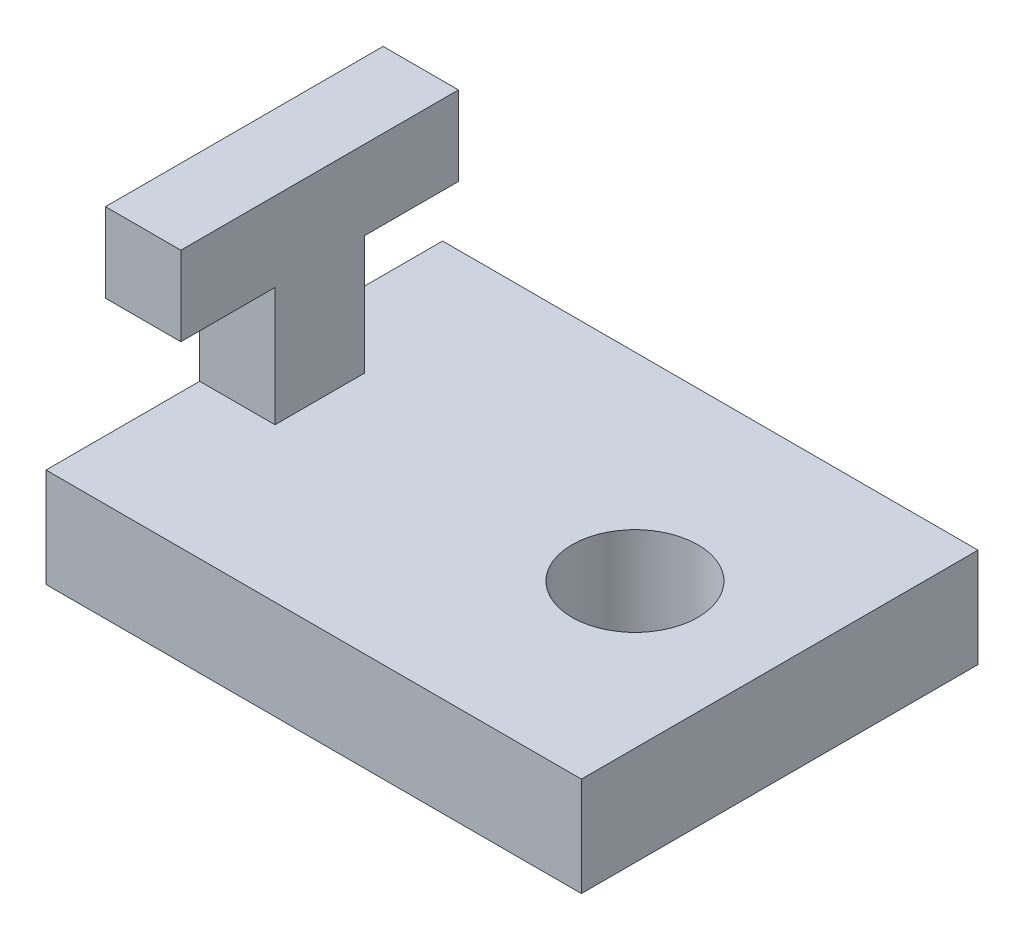
ISO-10303-21;
HEADER;
FILE_DESCRIPTION(('STEP AP214'),'2;1');
FILE_NAME('part.step','',(''),(''),'','','');
FILE_SCHEMA(('AUTOMOTIVE_DESIGN { 1 0 10303 214 1 1 1 1 }'));
ENDSEC;
DATA;
#1=APPLICATION_CONTEXT('core data for automotive mechanical design processes');
#2=APPLICATION_PROTOCOL_DEFINITION('international standard','automotive_design',2000,#1);
#3=PRODUCT_CONTEXT('',#1,'mechanical');
#4=PRODUCT('Part','Part','',(#3));
#5=PRODUCT_RELATED_PRODUCT_CATEGORY('part','',(#4));
#6=PRODUCT_DEFINITION_FORMATION('','',#4);
#7=PRODUCT_DEFINITION_CONTEXT('part definition',#1,'design');
#8=PRODUCT_DEFINITION('design','',#6,#7);
#9=PRODUCT_DEFINITION_SHAPE('','',#8);
#10=(LENGTH_UNIT() NAMED_UNIT(*) SI_UNIT(.MILLI.,.METRE.));
#11=(NAMED_UNIT(*) PLANE_ANGLE_UNIT() SI_UNIT($,.RADIAN.));
#12=(NAMED_UNIT(*) SI_UNIT($,.STERADIAN.) SOLID_ANGLE_UNIT());
#13=UNCERTAINTY_MEASURE_WITH_UNIT(LENGTH_MEASURE(1.E-05),#10,'distance_accuracy_value','');
#14=(GEOMETRIC_REPRESENTATION_CONTEXT(3) GLOBAL_UNCERTAINTY_ASSIGNED_CONTEXT((#13)) GLOBAL_UNIT_ASSIGNED_CONTEXT((#10,
#11,#12)) REPRESENTATION_CONTEXT('',''));
#15=CARTESIAN_POINT('',(0.,0.,0.));
#16=DIRECTION('',(0.,0.,1.));
#17=DIRECTION('',(1.,0.,0.));
#18=AXIS2_PLACEMENT_3D('',#15,#16,#17);
#19=CARTESIAN_POINT('',(-9.7,11.,-7.));
#20=DIRECTION('',(0.,0.,-1.));
#21=DIRECTION('',(0.,1.,0.));
#22=AXIS2_PLACEMENT_3D('',#19,#20,#21);
#23=PLANE('',#22);
#24=DIRECTION('',(0.,-1.,0.));
#25=VECTOR('',#24,1.);
#26=CARTESIAN_POINT('',(-13.5,11.,-7.));
#27=LINE('',#26,#25);
#28=CARTESIAN_POINT('',(-13.5,15.,-7.));
#29=VERTEX_POINT('',#28);
#30=CARTESIAN_POINT('',(-13.5,11.,-7.));
#31=VERTEX_POINT('',#30);
#32=EDGE_CURVE('E144',#29,#31,#27,.T.);
#33=ORIENTED_EDGE('',*,*,#32,.F.);
#34=DIRECTION('',(-1.,0.,0.));
#35=VECTOR('',#34,1.);
#36=CARTESIAN_POINT('',(-9.7,15.,-7.));
#37=LINE('',#36,#35);
#38=CARTESIAN_POINT('',(-9.7,15.,-7.));
#39=VERTEX_POINT('',#38);
#40=EDGE_CURVE('E12',#39,#29,#37,.T.);
#41=ORIENTED_EDGE('',*,*,#40,.F.);
#42=DIRECTION('',(0.,-1.,0.));
#43=VECTOR('',#42,1.);
#44=CARTESIAN_POINT('',(-9.7,11.,-7.));
#45=LINE('',#44,#43);
#46=CARTESIAN_POINT('',(-9.7,11.,-7.));
#47=VERTEX_POINT('',#46);
#48=EDGE_CURVE('E164',#39,#47,#45,.T.);
#49=ORIENTED_EDGE('',*,*,#48,.T.);
#50=DIRECTION('',(-1.,0.,0.));
#51=VECTOR('',#50,1.);
#52=CARTESIAN_POINT('',(-9.7,11.,-7.));
#53=LINE('',#52,#51);
#54=EDGE_CURVE('E50',#47,#31,#53,.T.);
#55=ORIENTED_EDGE('',*,*,#54,.T.);
#56=EDGE_LOOP('',(#33,#41,#49,#55));
#57=FACE_BOUND('',#56,.T.);
#58=ADVANCED_FACE('F47',(#57),#23,.T.);
#59=CARTESIAN_POINT('',(-9.7,15.,-7.));
#60=DIRECTION('',(0.,1.,0.));
#61=DIRECTION('',(0.,0.,1.));
#62=AXIS2_PLACEMENT_3D('',#59,#60,#61);
#63=PLANE('',#62);
#64=DIRECTION('',(0.,0.,-1.));
#65=VECTOR('',#64,1.);
#66=CARTESIAN_POINT('',(-13.5,15.,-7.));
#67=LINE('',#66,#65);
#68=CARTESIAN_POINT('',(-13.5,15.,7.));
#69=VERTEX_POINT('',#68);
#70=EDGE_CURVE('E162',#69,#29,#67,.T.);
#71=ORIENTED_EDGE('',*,*,#70,.F.);
#72=DIRECTION('',(-1.,0.,0.));
#73=VECTOR('',#72,1.);
#74=CARTESIAN_POINT('',(-9.7,15.,7.));
#75=LINE('',#74,#73);
#76=CARTESIAN_POINT('',(-9.7,15.,7.));
#77=VERTEX_POINT('',#76);
#78=EDGE_CURVE('E56',#77,#69,#75,.T.);
#79=ORIENTED_EDGE('',*,*,#78,.F.);
#80=DIRECTION('',(0.,0.,-1.));
#81=VECTOR('',#80,1.);
#82=CARTESIAN_POINT('',(-9.7,15.,-7.));
#83=LINE('',#82,#81);
#84=EDGE_CURVE('E134',#77,#39,#83,.T.);
#85=ORIENTED_EDGE('',*,*,#84,.T.);
#86=ORIENTED_EDGE('',*,*,#40,.T.);
#87=EDGE_LOOP('',(#71,#79,#85,#86));
#88=FACE_BOUND('',#87,.T.);
#89=ADVANCED_FACE('F176',(#88),#63,.T.);
#90=CARTESIAN_POINT('',(-9.7,15.,7.));
#91=DIRECTION('',(0.,0.,1.));
#92=DIRECTION('',(0.,-1.,0.));
#93=AXIS2_PLACEMENT_3D('',#90,#91,#92);
#94=PLANE('',#93);
#95=DIRECTION('',(0.,1.,0.));
#96=VECTOR('',#95,1.);
#97=CARTESIAN_POINT('',(-13.5,15.,7.));
#98=LINE('',#97,#96);
#99=CARTESIAN_POINT('',(-13.5,11.,7.));
#100=VERTEX_POINT('',#99);
#101=EDGE_CURVE('E121',#100,#69,#98,.T.);
#102=ORIENTED_EDGE('',*,*,#101,.F.);
#103=DIRECTION('',(-1.,0.,0.));
#104=VECTOR('',#103,1.);
#105=CARTESIAN_POINT('',(-9.7,11.,7.));
#106=LINE('',#105,#104);
#107=CARTESIAN_POINT('',(-9.7,11.,7.));
#108=VERTEX_POINT('',#107);
#109=EDGE_CURVE('E116',#108,#100,#106,.T.);
#110=ORIENTED_EDGE('',*,*,#109,.F.);
#111=DIRECTION('',(0.,1.,0.));
#112=VECTOR('',#111,1.);
#113=CARTESIAN_POINT('',(-9.7,15.,7.));
#114=LINE('',#113,#112);
#115=EDGE_CURVE('E119',#108,#77,#114,.T.);
#116=ORIENTED_EDGE('',*,*,#115,.T.);
#117=ORIENTED_EDGE('',*,*,#78,.T.);
#118=EDGE_LOOP('',(#102,#110,#116,#117));
#119=FACE_BOUND('',#118,.T.);
#120=ADVANCED_FACE('F118',(#119),#94,.T.);
#121=CARTESIAN_POINT('',(-9.7,11.,7.));
#122=DIRECTION('',(0.,-1.,0.));
#123=DIRECTION('',(0.,0.,-1.));
#124=AXIS2_PLACEMENT_3D('',#121,#122,#123);
#125=PLANE('',#124);
#126=DIRECTION('',(0.,0.,1.));
#127=VECTOR('',#126,1.);
#128=CARTESIAN_POINT('',(-13.5,11.,7.));
#129=LINE('',#128,#127);
#130=CARTESIAN_POINT('',(-13.5,11.,2.25));
#131=VERTEX_POINT('',#130);
#132=EDGE_CURVE('E159',#131,#100,#129,.T.);
#133=ORIENTED_EDGE('',*,*,#132,.F.);
#134=DIRECTION('',(-1.,0.,0.));
#135=VECTOR('',#134,1.);
#136=CARTESIAN_POINT('',(-9.7,11.,2.25));
#137=LINE('',#136,#135);
#138=CARTESIAN_POINT('',(-9.7,11.,2.25));
#139=VERTEX_POINT('',#138);
#140=EDGE_CURVE('E126',#139,#131,#137,.T.);
#141=ORIENTED_EDGE('',*,*,#140,.F.);
#142=DIRECTION('',(0.,0.,1.));
#143=VECTOR('',#142,1.);
#144=CARTESIAN_POINT('',(-9.7,11.,7.));
#145=LINE('',#144,#143);
#146=EDGE_CURVE('E132',#139,#108,#145,.T.);
#147=ORIENTED_EDGE('',*,*,#146,.T.);
#148=ORIENTED_EDGE('',*,*,#109,.T.);
#149=EDGE_LOOP('',(#133,#141,#147,#148));
#150=FACE_BOUND('',#149,.T.);
#151=ADVANCED_FACE('F136',(#150),#125,.T.);
#152=CARTESIAN_POINT('',(-9.7,11.,2.25));
#153=DIRECTION('',(0.,0.,1.));
#154=DIRECTION('',(0.,-1.,0.));
#155=AXIS2_PLACEMENT_3D('',#152,#153,#154);
#156=PLANE('',#155);
#157=DIRECTION('',(0.,1.,0.));
#158=VECTOR('',#157,1.);
#159=CARTESIAN_POINT('',(-13.5,11.,2.25));
#160=LINE('',#159,#158);
#161=CARTESIAN_POINT('',(-13.5,5.,2.25));
#162=VERTEX_POINT('',#161);
#163=EDGE_CURVE('E156',#162,#131,#160,.T.);
#164=ORIENTED_EDGE('',*,*,#163,.F.);
#165=DIRECTION('',(-1.,0.,0.));
#166=VECTOR('',#165,1.);
#167=CARTESIAN_POINT('',(-9.7,5.,2.25));
#168=LINE('',#167,#166);
#169=CARTESIAN_POINT('',(-9.7,5.,2.25));
#170=VERTEX_POINT('',#169);
#171=EDGE_CURVE('E168',#170,#162,#168,.T.);
#172=ORIENTED_EDGE('',*,*,#171,.F.);
#173=DIRECTION('',(0.,1.,0.));
#174=VECTOR('',#173,1.);
#175=CARTESIAN_POINT('',(-9.7,11.,2.25));
#176=LINE('',#175,#174);
#177=EDGE_CURVE('E137',#170,#139,#176,.T.);
#178=ORIENTED_EDGE('',*,*,#177,.T.);
#179=ORIENTED_EDGE('',*,*,#140,.T.);
#180=EDGE_LOOP('',(#164,#172,#178,#179));
#181=FACE_BOUND('',#180,.T.);
#182=ADVANCED_FACE('F189',(#181),#156,.T.);
#183=CARTESIAN_POINT('',(-9.7,5.,2.25));
#184=DIRECTION('',(0.,-1.,0.));
#185=DIRECTION('',(0.,0.,-1.));
#186=AXIS2_PLACEMENT_3D('',#183,#184,#185);
#187=PLANE('',#186);
#188=DIRECTION('',(0.,0.,1.));
#189=VECTOR('',#188,1.);
#190=CARTESIAN_POINT('',(-13.5,5.,2.25));
#191=LINE('',#190,#189);
#192=CARTESIAN_POINT('',(-13.5,5.,-2.25));
#193=VERTEX_POINT('',#192);
#194=EDGE_CURVE('E153',#193,#162,#191,.T.);
#195=ORIENTED_EDGE('',*,*,#194,.F.);
#196=DIRECTION('',(-1.,0.,0.));
#197=VECTOR('',#196,1.);
#198=CARTESIAN_POINT('',(-9.7,5.,-2.25));
#199=LINE('',#198,#197);
#200=CARTESIAN_POINT('',(-9.7,5.,-2.25));
#201=VERTEX_POINT('',#200);
#202=EDGE_CURVE('E170',#201,#193,#199,.T.);
#203=ORIENTED_EDGE('',*,*,#202,.F.);
#204=DIRECTION('',(0.,0.,1.));
#205=VECTOR('',#204,1.);
#206=CARTESIAN_POINT('',(-9.7,5.,2.25));
#207=LINE('',#206,#205);
#208=EDGE_CURVE('E139',#201,#170,#207,.T.);
#209=ORIENTED_EDGE('',*,*,#208,.T.);
#210=ORIENTED_EDGE('',*,*,#171,.T.);
#211=EDGE_LOOP('',(#195,#203,#209,#210));
#212=FACE_BOUND('',#211,.T.);
#213=ADVANCED_FACE('F192',(#212),#187,.T.);
#214=CARTESIAN_POINT('',(-9.7,5.,-2.25));
#215=DIRECTION('',(0.,0.,-1.));
#216=DIRECTION('',(0.,1.,0.));
#217=AXIS2_PLACEMENT_3D('',#214,#215,#216);
#218=PLANE('',#217);
#219=DIRECTION('',(0.,-1.,0.));
#220=VECTOR('',#219,1.);
#221=CARTESIAN_POINT('',(-13.5,5.,-2.25));
#222=LINE('',#221,#220);
#223=CARTESIAN_POINT('',(-13.5,11.,-2.25));
#224=VERTEX_POINT('',#223);
#225=EDGE_CURVE('E150',#224,#193,#222,.T.);
#226=ORIENTED_EDGE('',*,*,#225,.F.);
#227=DIRECTION('',(-1.,0.,0.));
#228=VECTOR('',#227,1.);
#229=CARTESIAN_POINT('',(-9.7,11.,-2.25));
#230=LINE('',#229,#228);
#231=CARTESIAN_POINT('',(-9.7,11.,-2.25));
#232=VERTEX_POINT('',#231);
#233=EDGE_CURVE('E171',#232,#224,#230,.T.);
#234=ORIENTED_EDGE('',*,*,#233,.F.);
#235=DIRECTION('',(0.,-1.,0.));
#236=VECTOR('',#235,1.);
#237=CARTESIAN_POINT('',(-9.7,5.,-2.25));
#238=LINE('',#237,#236);
#239=EDGE_CURVE('E267',#232,#201,#238,.T.);
#240=ORIENTED_EDGE('',*,*,#239,.T.);
#241=ORIENTED_EDGE('',*,*,#202,.T.);
#242=EDGE_LOOP('',(#226,#234,#240,#241));
#243=FACE_BOUND('',#242,.T.);
#244=ADVANCED_FACE('F196',(#243),#218,.T.);
#245=CARTESIAN_POINT('',(-9.7,11.,-2.25));
#246=DIRECTION('',(0.,-1.,0.));
#247=DIRECTION('',(0.,0.,-1.));
#248=AXIS2_PLACEMENT_3D('',#245,#246,#247);
#249=PLANE('',#248);
#250=DIRECTION('',(0.,0.,1.));
#251=VECTOR('',#250,1.);
#252=CARTESIAN_POINT('',(-13.5,11.,-2.25));
#253=LINE('',#252,#251);
#254=EDGE_CURVE('E147',#31,#224,#253,.T.);
#255=ORIENTED_EDGE('',*,*,#254,.F.);
#256=ORIENTED_EDGE('',*,*,#54,.F.);
#257=DIRECTION('',(0.,0.,1.));
#258=VECTOR('',#257,1.);
#259=CARTESIAN_POINT('',(-9.7,11.,-2.25));
#260=LINE('',#259,#258);
#261=EDGE_CURVE('E268',#47,#232,#260,.T.);
#262=ORIENTED_EDGE('',*,*,#261,.T.);
#263=ORIENTED_EDGE('',*,*,#233,.T.);
#264=EDGE_LOOP('',(#255,#256,#262,#263));
#265=FACE_BOUND('',#264,.T.);
#266=ADVANCED_FACE('F173',(#265),#249,.T.);
#267=CARTESIAN_POINT('',(-9.7,0.,0.));
#268=DIRECTION('',(1.,0.,0.));
#269=DIRECTION('',(0.,0.,-1.));
#270=AXIS2_PLACEMENT_3D('',#267,#268,#269);
#271=PLANE('',#270);
#272=ORIENTED_EDGE('',*,*,#48,.F.);
#273=ORIENTED_EDGE('',*,*,#84,.F.);
#274=ORIENTED_EDGE('',*,*,#115,.F.);
#275=ORIENTED_EDGE('',*,*,#146,.F.);
#276=ORIENTED_EDGE('',*,*,#177,.F.);
#277=ORIENTED_EDGE('',*,*,#208,.F.);
#278=ORIENTED_EDGE('',*,*,#239,.F.);
#279=ORIENTED_EDGE('',*,*,#261,.F.);
#280=EDGE_LOOP('',(#272,#273,#274,#275,#276,#277,#278,#279));
#281=FACE_BOUND('',#280,.T.);
#282=ADVANCED_FACE('F130',(#281),#271,.T.);
#283=CARTESIAN_POINT('',(-13.5,0.,0.));
#284=DIRECTION('',(1.,0.,0.));
#285=DIRECTION('',(0.,0.,-1.));
#286=AXIS2_PLACEMENT_3D('',#283,#284,#285);
#287=PLANE('',#286);
#288=ORIENTED_EDGE('',*,*,#32,.T.);
#289=ORIENTED_EDGE('',*,*,#254,.T.);
#290=ORIENTED_EDGE('',*,*,#225,.T.);
#291=ORIENTED_EDGE('',*,*,#194,.T.);
#292=ORIENTED_EDGE('',*,*,#163,.T.);
#293=ORIENTED_EDGE('',*,*,#132,.T.);
#294=ORIENTED_EDGE('',*,*,#101,.T.);
#295=ORIENTED_EDGE('',*,*,#70,.T.);
#296=EDGE_LOOP('',(#288,#289,#290,#291,#292,#293,#294,#295));
#297=FACE_BOUND('',#296,.T.);
#298=ADVANCED_FACE('F175',(#297),#287,.F.);
#299=CLOSED_SHELL('',(#58,#89,#120,#151,#182,#213,#244,#266,#282,#298));
#300=MANIFOLD_SOLID_BREP('B2',#299);
#301=CARTESIAN_POINT('',(-13.5,5.,10.));
#302=DIRECTION('',(1.,0.,0.));
#303=DIRECTION('',(0.,0.,-1.));
#304=AXIS2_PLACEMENT_3D('',#301,#302,#303);
#305=PLANE('',#304);
#306=DIRECTION('',(0.,0.,1.));
#307=VECTOR('',#306,1.);
#308=CARTESIAN_POINT('',(-13.5,0.,10.));
#309=LINE('',#308,#307);
#310=CARTESIAN_POINT('',(-13.5,0.,-10.));
#311=VERTEX_POINT('',#310);
#312=CARTESIAN_POINT('',(-13.5,0.,10.));
#313=VERTEX_POINT('',#312);
#314=EDGE_CURVE('E338',#311,#313,#309,.T.);
#315=ORIENTED_EDGE('',*,*,#314,.T.);
#316=DIRECTION('',(0.,-1.,0.));
#317=VECTOR('',#316,1.);
#318=CARTESIAN_POINT('',(-13.5,5.,10.));
#319=LINE('',#318,#317);
#320=CARTESIAN_POINT('',(-13.5,5.,10.));
#321=VERTEX_POINT('',#320);
#322=EDGE_CURVE('E45',#321,#313,#319,.T.);
#323=ORIENTED_EDGE('',*,*,#322,.F.);
#324=DIRECTION('',(0.,0.,1.));
#325=VECTOR('',#324,1.);
#326=CARTESIAN_POINT('',(-13.5,5.,10.));
#327=LINE('',#326,#325);
#328=CARTESIAN_POINT('',(-13.5,5.,-10.));
#329=VERTEX_POINT('',#328);
#330=EDGE_CURVE('E326',#329,#321,#327,.T.);
#331=ORIENTED_EDGE('',*,*,#330,.F.);
#332=DIRECTION('',(0.,-1.,0.));
#333=VECTOR('',#332,1.);
#334=CARTESIAN_POINT('',(-13.5,5.,-10.));
#335=LINE('',#334,#333);
#336=EDGE_CURVE('E334',#329,#311,#335,.T.);
#337=ORIENTED_EDGE('',*,*,#336,.T.);
#338=EDGE_LOOP('',(#315,#323,#331,#337));
#339=FACE_BOUND('',#338,.T.);
#340=ADVANCED_FACE('F275',(#339),#305,.F.);
#341=CARTESIAN_POINT('',(13.5,5.,10.));
#342=DIRECTION('',(0.,0.,-1.));
#343=DIRECTION('',(-1.,0.,0.));
#344=AXIS2_PLACEMENT_3D('',#341,#342,#343);
#345=PLANE('',#344);
#346=DIRECTION('',(1.,0.,0.));
#347=VECTOR('',#346,1.);
#348=CARTESIAN_POINT('',(13.5,0.,10.));
#349=LINE('',#348,#347);
#350=CARTESIAN_POINT('',(13.5,0.,10.));
#351=VERTEX_POINT('',#350);
#352=EDGE_CURVE('E330',#313,#351,#349,.T.);
#353=ORIENTED_EDGE('',*,*,#352,.T.);
#354=DIRECTION('',(0.,-1.,0.));
#355=VECTOR('',#354,1.);
#356=CARTESIAN_POINT('',(13.5,5.,10.));
#357=LINE('',#356,#355);
#358=CARTESIAN_POINT('',(13.5,5.,10.));
#359=VERTEX_POINT('',#358);
#360=EDGE_CURVE('E283',#359,#351,#357,.T.);
#361=ORIENTED_EDGE('',*,*,#360,.F.);
#362=DIRECTION('',(1.,0.,0.));
#363=VECTOR('',#362,1.);
#364=CARTESIAN_POINT('',(13.5,5.,10.));
#365=LINE('',#364,#363);
#366=EDGE_CURVE('E321',#321,#359,#365,.T.);
#367=ORIENTED_EDGE('',*,*,#366,.F.);
#368=ORIENTED_EDGE('',*,*,#322,.T.);
#369=EDGE_LOOP('',(#353,#361,#367,#368));
#370=FACE_BOUND('',#369,.T.);
#371=ADVANCED_FACE('F329',(#370),#345,.F.);
#372=CARTESIAN_POINT('',(13.5,5.,10.));
#373=DIRECTION('',(-1.,0.,0.));
#374=DIRECTION('',(0.,0.,1.));
#375=AXIS2_PLACEMENT_3D('',#372,#373,#374);
#376=PLANE('',#375);
#377=DIRECTION('',(0.,0.,-1.));
#378=VECTOR('',#377,1.);
#379=CARTESIAN_POINT('',(13.5,0.,10.));
#380=LINE('',#379,#378);
#381=CARTESIAN_POINT('',(13.5,0.,-10.));
#382=VERTEX_POINT('',#381);
#383=EDGE_CURVE('E308',#351,#382,#380,.T.);
#384=ORIENTED_EDGE('',*,*,#383,.T.);
#385=DIRECTION('',(0.,-1.,0.));
#386=VECTOR('',#385,1.);
#387=CARTESIAN_POINT('',(13.5,5.,-10.));
#388=LINE('',#387,#386);
#389=CARTESIAN_POINT('',(13.5,5.,-10.));
#390=VERTEX_POINT('',#389);
#391=EDGE_CURVE('E331',#390,#382,#388,.T.);
#392=ORIENTED_EDGE('',*,*,#391,.F.);
#393=DIRECTION('',(0.,0.,-1.));
#394=VECTOR('',#393,1.);
#395=CARTESIAN_POINT('',(13.5,5.,10.));
#396=LINE('',#395,#394);
#397=EDGE_CURVE('E324',#359,#390,#396,.T.);
#398=ORIENTED_EDGE('',*,*,#397,.F.);
#399=ORIENTED_EDGE('',*,*,#360,.T.);
#400=EDGE_LOOP('',(#384,#392,#398,#399));
#401=FACE_BOUND('',#400,.T.);
#402=ADVANCED_FACE('F332',(#401),#376,.F.);
#403=CARTESIAN_POINT('',(13.5,5.,-10.));
#404=DIRECTION('',(0.,0.,1.));
#405=DIRECTION('',(1.,0.,0.));
#406=AXIS2_PLACEMENT_3D('',#403,#404,#405);
#407=PLANE('',#406);
#408=DIRECTION('',(-1.,0.,0.));
#409=VECTOR('',#408,1.);
#410=CARTESIAN_POINT('',(13.5,0.,-10.));
#411=LINE('',#410,#409);
#412=EDGE_CURVE('E314',#382,#311,#411,.T.);
#413=ORIENTED_EDGE('',*,*,#412,.T.);
#414=ORIENTED_EDGE('',*,*,#336,.F.);
#415=DIRECTION('',(-1.,0.,0.));
#416=VECTOR('',#415,1.);
#417=CARTESIAN_POINT('',(13.5,5.,-10.));
#418=LINE('',#417,#416);
#419=EDGE_CURVE('E291',#390,#329,#418,.T.);
#420=ORIENTED_EDGE('',*,*,#419,.F.);
#421=ORIENTED_EDGE('',*,*,#391,.T.);
#422=EDGE_LOOP('',(#413,#414,#420,#421));
#423=FACE_BOUND('',#422,.T.);
#424=ADVANCED_FACE('F346',(#423),#407,.F.);
#425=CARTESIAN_POINT('',(0.,5.,0.));
#426=DIRECTION('',(0.,1.,0.));
#427=DIRECTION('',(0.,0.,1.));
#428=AXIS2_PLACEMENT_3D('',#425,#426,#427);
#429=PLANE('',#428);
#430=CARTESIAN_POINT('',(6.2,5.,0.));
#431=DIRECTION('',(0.,1.,0.));
#432=DIRECTION('',(0.,0.,1.));
#433=AXIS2_PLACEMENT_3D('',#430,#431,#432);
#434=CIRCLE('',#433,3.175);
#435=CARTESIAN_POINT('',(6.2,5.,3.175));
#436=VERTEX_POINT('',#435);
#437=EDGE_CURVE('E341',#436,#436,#434,.T.);
#438=ORIENTED_EDGE('',*,*,#437,.F.);
#439=EDGE_LOOP('',(#438));
#440=FACE_BOUND('',#439,.T.);
#441=ORIENTED_EDGE('',*,*,#330,.T.);
#442=ORIENTED_EDGE('',*,*,#366,.T.);
#443=ORIENTED_EDGE('',*,*,#397,.T.);
#444=ORIENTED_EDGE('',*,*,#419,.T.);
#445=EDGE_LOOP('',(#441,#442,#443,#444));
#446=FACE_BOUND('',#445,.T.);
#447=ADVANCED_FACE('F322',(#440,#446),#429,.T.);
#448=CARTESIAN_POINT('',(0.,0.,0.));
#449=DIRECTION('',(0.,1.,0.));
#450=DIRECTION('',(0.,0.,1.));
#451=AXIS2_PLACEMENT_3D('',#448,#449,#450);
#452=PLANE('',#451);
#453=CARTESIAN_POINT('',(6.2,0.,0.));
#454=DIRECTION('',(0.,-1.,0.));
#455=DIRECTION('',(0.,0.,-1.));
#456=AXIS2_PLACEMENT_3D('',#453,#454,#455);
#457=CIRCLE('',#456,3.175);
#458=CARTESIAN_POINT('',(6.2,0.,-3.175));
#459=VERTEX_POINT('',#458);
#460=EDGE_CURVE('E354',#459,#459,#457,.T.);
#461=ORIENTED_EDGE('',*,*,#460,.F.);
#462=EDGE_LOOP('',(#461));
#463=FACE_BOUND('',#462,.T.);
#464=ORIENTED_EDGE('',*,*,#314,.F.);
#465=ORIENTED_EDGE('',*,*,#412,.F.);
#466=ORIENTED_EDGE('',*,*,#383,.F.);
#467=ORIENTED_EDGE('',*,*,#352,.F.);
#468=EDGE_LOOP('',(#464,#465,#466,#467));
#469=FACE_BOUND('',#468,.T.);
#470=ADVANCED_FACE('F349',(#463,#469),#452,.F.);
#471=CARTESIAN_POINT('',(6.2,10.,0.));
#472=DIRECTION('',(0.,-1.,0.));
#473=DIRECTION('',(0.,0.,-1.));
#474=AXIS2_PLACEMENT_3D('',#471,#472,#473);
#475=CYLINDRICAL_SURFACE('',#474,3.175);
#476=ORIENTED_EDGE('',*,*,#437,.T.);
#477=EDGE_LOOP('',(#476));
#478=FACE_BOUND('',#477,.T.);
#479=ORIENTED_EDGE('',*,*,#460,.T.);
#480=EDGE_LOOP('',(#479));
#481=FACE_BOUND('',#480,.T.);
#482=ADVANCED_FACE('F358',(#478,#481),#475,.F.);
#483=CLOSED_SHELL('',(#340,#371,#402,#424,#447,#470,#482));
#484=MANIFOLD_SOLID_BREP('B6',#483);
#485=ADVANCED_BREP_SHAPE_REPRESENTATION('',(#18,#300,#484),#14);
#486=SHAPE_DEFINITION_REPRESENTATION(#9,#485);
ENDSEC;
END-ISO-10303-21;
